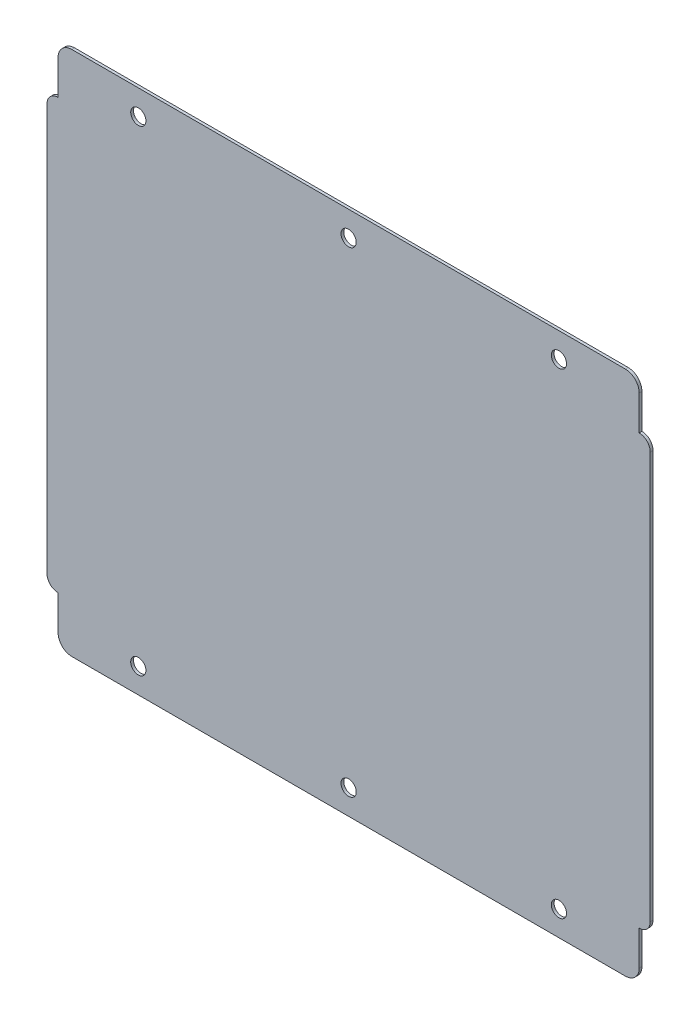
ISO-10303-21;
HEADER;
FILE_DESCRIPTION(('STEP AP214'),'2;1');
FILE_NAME('part.step','',(''),(''),'','','');
FILE_SCHEMA(('AUTOMOTIVE_DESIGN { 1 0 10303 214 1 1 1 1 }'));
ENDSEC;
DATA;
#1=APPLICATION_CONTEXT('core data for automotive mechanical design processes');
#2=APPLICATION_PROTOCOL_DEFINITION('international standard','automotive_design',2000,#1);
#3=PRODUCT_CONTEXT('',#1,'mechanical');
#4=PRODUCT('Part','Part','',(#3));
#5=PRODUCT_RELATED_PRODUCT_CATEGORY('part','',(#4));
#6=PRODUCT_DEFINITION_FORMATION('','',#4);
#7=PRODUCT_DEFINITION_CONTEXT('part definition',#1,'design');
#8=PRODUCT_DEFINITION('design','',#6,#7);
#9=PRODUCT_DEFINITION_SHAPE('','',#8);
#10=(LENGTH_UNIT() NAMED_UNIT(*) SI_UNIT(.MILLI.,.METRE.));
#11=(NAMED_UNIT(*) PLANE_ANGLE_UNIT() SI_UNIT($,.RADIAN.));
#12=(NAMED_UNIT(*) SI_UNIT($,.STERADIAN.) SOLID_ANGLE_UNIT());
#13=UNCERTAINTY_MEASURE_WITH_UNIT(LENGTH_MEASURE(1.E-05),#10,'distance_accuracy_value','');
#14=(GEOMETRIC_REPRESENTATION_CONTEXT(3) GLOBAL_UNCERTAINTY_ASSIGNED_CONTEXT((#13)) GLOBAL_UNIT_ASSIGNED_CONTEXT((#10,
#11,#12)) REPRESENTATION_CONTEXT('',''));
#15=CARTESIAN_POINT('',(0.,0.,0.));
#16=DIRECTION('',(0.,0.,1.));
#17=DIRECTION('',(1.,0.,0.));
#18=AXIS2_PLACEMENT_3D('',#15,#16,#17);
#19=CARTESIAN_POINT('',(210.,155.,1.));
#20=DIRECTION('',(-1.,0.,0.));
#21=DIRECTION('',(0.,0.,1.));
#22=AXIS2_PLACEMENT_3D('',#19,#20,#21);
#23=PLANE('',#22);
#24=DIRECTION('',(0.,1.,0.));
#25=VECTOR('',#24,1.);
#26=CARTESIAN_POINT('',(210.,155.,-1.));
#27=LINE('',#26,#25);
#28=CARTESIAN_POINT('',(210.,155.,-1.));
#29=VERTEX_POINT('',#28);
#30=CARTESIAN_POINT('',(210.,180.,-1.));
#31=VERTEX_POINT('',#30);
#32=EDGE_CURVE('E254',#29,#31,#27,.T.);
#33=ORIENTED_EDGE('',*,*,#32,.T.);
#34=DIRECTION('',(0.,0.,-1.));
#35=VECTOR('',#34,1.);
#36=CARTESIAN_POINT('',(210.,180.,1.));
#37=LINE('',#36,#35);
#38=CARTESIAN_POINT('',(210.,180.,1.));
#39=VERTEX_POINT('',#38);
#40=EDGE_CURVE('E170',#31,#39,#37,.F.);
#41=ORIENTED_EDGE('',*,*,#40,.T.);
#42=DIRECTION('',(0.,1.,0.));
#43=VECTOR('',#42,1.);
#44=CARTESIAN_POINT('',(210.,155.,1.));
#45=LINE('',#44,#43);
#46=CARTESIAN_POINT('',(210.,155.,1.));
#47=VERTEX_POINT('',#46);
#48=EDGE_CURVE('E158',#47,#39,#45,.T.);
#49=ORIENTED_EDGE('',*,*,#48,.F.);
#50=DIRECTION('',(0.,0.,-1.));
#51=VECTOR('',#50,1.);
#52=CARTESIAN_POINT('',(210.,155.,1.));
#53=LINE('',#52,#51);
#54=EDGE_CURVE('E168',#47,#29,#53,.T.);
#55=ORIENTED_EDGE('',*,*,#54,.T.);
#56=EDGE_LOOP('',(#33,#41,#49,#55));
#57=FACE_BOUND('',#56,.T.);
#58=ADVANCED_FACE('F41',(#57),#23,.F.);
#59=CARTESIAN_POINT('',(-210.,190.,1.));
#60=DIRECTION('',(0.,-1.,0.));
#61=DIRECTION('',(0.,0.,-1.));
#62=AXIS2_PLACEMENT_3D('',#59,#60,#61);
#63=PLANE('',#62);
#64=DIRECTION('',(-1.,0.,0.));
#65=VECTOR('',#64,1.);
#66=CARTESIAN_POINT('',(-210.,190.,1.));
#67=LINE('',#66,#65);
#68=CARTESIAN_POINT('',(200.,190.,1.));
#69=VERTEX_POINT('',#68);
#70=CARTESIAN_POINT('',(-200.,190.,1.));
#71=VERTEX_POINT('',#70);
#72=EDGE_CURVE('E171',#69,#71,#67,.T.);
#73=ORIENTED_EDGE('',*,*,#72,.F.);
#74=DIRECTION('',(0.,0.,-1.));
#75=VECTOR('',#74,1.);
#76=CARTESIAN_POINT('',(200.,190.,1.));
#77=LINE('',#76,#75);
#78=CARTESIAN_POINT('',(200.,190.,-1.));
#79=VERTEX_POINT('',#78);
#80=EDGE_CURVE('E180',#69,#79,#77,.T.);
#81=ORIENTED_EDGE('',*,*,#80,.T.);
#82=DIRECTION('',(-1.,0.,0.));
#83=VECTOR('',#82,1.);
#84=CARTESIAN_POINT('',(-210.,190.,-1.));
#85=LINE('',#84,#83);
#86=CARTESIAN_POINT('',(-200.,190.,-1.));
#87=VERTEX_POINT('',#86);
#88=EDGE_CURVE('E257',#79,#87,#85,.T.);
#89=ORIENTED_EDGE('',*,*,#88,.T.);
#90=DIRECTION('',(0.,0.,-1.));
#91=VECTOR('',#90,1.);
#92=CARTESIAN_POINT('',(-200.,190.,1.));
#93=LINE('',#92,#91);
#94=EDGE_CURVE('E177',#87,#71,#93,.F.);
#95=ORIENTED_EDGE('',*,*,#94,.T.);
#96=EDGE_LOOP('',(#73,#81,#89,#95));
#97=FACE_BOUND('',#96,.T.);
#98=ADVANCED_FACE('F363',(#97),#63,.F.);
#99=CARTESIAN_POINT('',(-210.,155.,1.));
#100=DIRECTION('',(1.,0.,0.));
#101=DIRECTION('',(0.,0.,-1.));
#102=AXIS2_PLACEMENT_3D('',#99,#100,#101);
#103=PLANE('',#102);
#104=DIRECTION('',(0.,-1.,0.));
#105=VECTOR('',#104,1.);
#106=CARTESIAN_POINT('',(-210.,155.,1.));
#107=LINE('',#106,#105);
#108=CARTESIAN_POINT('',(-210.,180.,1.));
#109=VERTEX_POINT('',#108);
#110=CARTESIAN_POINT('',(-210.,155.,1.));
#111=VERTEX_POINT('',#110);
#112=EDGE_CURVE('E314',#109,#111,#107,.T.);
#113=ORIENTED_EDGE('',*,*,#112,.F.);
#114=DIRECTION('',(0.,0.,-1.));
#115=VECTOR('',#114,1.);
#116=CARTESIAN_POINT('',(-210.,180.,1.));
#117=LINE('',#116,#115);
#118=CARTESIAN_POINT('',(-210.,180.,-1.));
#119=VERTEX_POINT('',#118);
#120=EDGE_CURVE('E216',#109,#119,#117,.T.);
#121=ORIENTED_EDGE('',*,*,#120,.T.);
#122=DIRECTION('',(0.,-1.,0.));
#123=VECTOR('',#122,1.);
#124=CARTESIAN_POINT('',(-210.,155.,-1.));
#125=LINE('',#124,#123);
#126=CARTESIAN_POINT('',(-210.,155.,-1.));
#127=VERTEX_POINT('',#126);
#128=EDGE_CURVE('E260',#119,#127,#125,.T.);
#129=ORIENTED_EDGE('',*,*,#128,.T.);
#130=DIRECTION('',(0.,0.,-1.));
#131=VECTOR('',#130,1.);
#132=CARTESIAN_POINT('',(-210.,155.,1.));
#133=LINE('',#132,#131);
#134=EDGE_CURVE('E178',#111,#127,#133,.T.);
#135=ORIENTED_EDGE('',*,*,#134,.F.);
#136=EDGE_LOOP('',(#113,#121,#129,#135));
#137=FACE_BOUND('',#136,.T.);
#138=ADVANCED_FACE('F370',(#137),#103,.F.);
#139=CARTESIAN_POINT('',(-218.,-155.,1.));
#140=DIRECTION('',(1.,0.,0.));
#141=DIRECTION('',(0.,0.,-1.));
#142=AXIS2_PLACEMENT_3D('',#139,#140,#141);
#143=PLANE('',#142);
#144=DIRECTION('',(0.,-1.,0.));
#145=VECTOR('',#144,1.);
#146=CARTESIAN_POINT('',(-218.,-155.,-1.));
#147=LINE('',#146,#145);
#148=CARTESIAN_POINT('',(-218.,147.,-1.));
#149=VERTEX_POINT('',#148);
#150=CARTESIAN_POINT('',(-218.,-147.,-1.));
#151=VERTEX_POINT('',#150);
#152=EDGE_CURVE('E267',#149,#151,#147,.T.);
#153=ORIENTED_EDGE('',*,*,#152,.T.);
#154=DIRECTION('',(0.,0.,-1.));
#155=VECTOR('',#154,1.);
#156=CARTESIAN_POINT('',(-218.,-147.,1.));
#157=LINE('',#156,#155);
#158=CARTESIAN_POINT('',(-218.,-147.,1.));
#159=VERTEX_POINT('',#158);
#160=EDGE_CURVE('E229',#151,#159,#157,.F.);
#161=ORIENTED_EDGE('',*,*,#160,.T.);
#162=DIRECTION('',(0.,-1.,0.));
#163=VECTOR('',#162,1.);
#164=CARTESIAN_POINT('',(-218.,-155.,1.));
#165=LINE('',#164,#163);
#166=CARTESIAN_POINT('',(-218.,147.,1.));
#167=VERTEX_POINT('',#166);
#168=EDGE_CURVE('E310',#167,#159,#165,.T.);
#169=ORIENTED_EDGE('',*,*,#168,.F.);
#170=DIRECTION('',(0.,0.,-1.));
#171=VECTOR('',#170,1.);
#172=CARTESIAN_POINT('',(-218.,147.,1.));
#173=LINE('',#172,#171);
#174=EDGE_CURVE('E226',#167,#149,#173,.T.);
#175=ORIENTED_EDGE('',*,*,#174,.T.);
#176=EDGE_LOOP('',(#153,#161,#169,#175));
#177=FACE_BOUND('',#176,.T.);
#178=ADVANCED_FACE('F414',(#177),#143,.F.);
#179=CARTESIAN_POINT('',(-210.,-155.,1.));
#180=DIRECTION('',(1.,0.,0.));
#181=DIRECTION('',(0.,0.,-1.));
#182=AXIS2_PLACEMENT_3D('',#179,#180,#181);
#183=PLANE('',#182);
#184=DIRECTION('',(0.,-1.,0.));
#185=VECTOR('',#184,1.);
#186=CARTESIAN_POINT('',(-210.,-155.,-1.));
#187=LINE('',#186,#185);
#188=CARTESIAN_POINT('',(-210.,-155.,-1.));
#189=VERTEX_POINT('',#188);
#190=CARTESIAN_POINT('',(-210.,-180.,-1.));
#191=VERTEX_POINT('',#190);
#192=EDGE_CURVE('E270',#189,#191,#187,.T.);
#193=ORIENTED_EDGE('',*,*,#192,.T.);
#194=DIRECTION('',(0.,0.,-1.));
#195=VECTOR('',#194,1.);
#196=CARTESIAN_POINT('',(-210.,-180.,1.));
#197=LINE('',#196,#195);
#198=CARTESIAN_POINT('',(-210.,-180.,1.));
#199=VERTEX_POINT('',#198);
#200=EDGE_CURVE('E214',#191,#199,#197,.F.);
#201=ORIENTED_EDGE('',*,*,#200,.T.);
#202=DIRECTION('',(0.,-1.,0.));
#203=VECTOR('',#202,1.);
#204=CARTESIAN_POINT('',(-210.,-155.,1.));
#205=LINE('',#204,#203);
#206=CARTESIAN_POINT('',(-210.,-155.,1.));
#207=VERTEX_POINT('',#206);
#208=EDGE_CURVE('E290',#207,#199,#205,.T.);
#209=ORIENTED_EDGE('',*,*,#208,.F.);
#210=DIRECTION('',(0.,0.,-1.));
#211=VECTOR('',#210,1.);
#212=CARTESIAN_POINT('',(-210.,-155.,1.));
#213=LINE('',#212,#211);
#214=EDGE_CURVE('E183',#207,#189,#213,.T.);
#215=ORIENTED_EDGE('',*,*,#214,.T.);
#216=EDGE_LOOP('',(#193,#201,#209,#215));
#217=FACE_BOUND('',#216,.T.);
#218=ADVANCED_FACE('F287',(#217),#183,.F.);
#219=CARTESIAN_POINT('',(-210.,-190.,1.));
#220=DIRECTION('',(0.,1.,0.));
#221=DIRECTION('',(0.,0.,1.));
#222=AXIS2_PLACEMENT_3D('',#219,#220,#221);
#223=PLANE('',#222);
#224=DIRECTION('',(1.,0.,0.));
#225=VECTOR('',#224,1.);
#226=CARTESIAN_POINT('',(-210.,-190.,-1.));
#227=LINE('',#226,#225);
#228=CARTESIAN_POINT('',(-200.,-190.,-1.));
#229=VERTEX_POINT('',#228);
#230=CARTESIAN_POINT('',(200.,-190.,-1.));
#231=VERTEX_POINT('',#230);
#232=EDGE_CURVE('E273',#229,#231,#227,.T.);
#233=ORIENTED_EDGE('',*,*,#232,.T.);
#234=DIRECTION('',(0.,0.,-1.));
#235=VECTOR('',#234,1.);
#236=CARTESIAN_POINT('',(200.,-190.,1.));
#237=LINE('',#236,#235);
#238=CARTESIAN_POINT('',(200.,-190.,1.));
#239=VERTEX_POINT('',#238);
#240=EDGE_CURVE('E212',#231,#239,#237,.F.);
#241=ORIENTED_EDGE('',*,*,#240,.T.);
#242=DIRECTION('',(1.,0.,0.));
#243=VECTOR('',#242,1.);
#244=CARTESIAN_POINT('',(-210.,-190.,1.));
#245=LINE('',#244,#243);
#246=CARTESIAN_POINT('',(-200.,-190.,1.));
#247=VERTEX_POINT('',#246);
#248=EDGE_CURVE('E306',#247,#239,#245,.T.);
#249=ORIENTED_EDGE('',*,*,#248,.F.);
#250=DIRECTION('',(0.,0.,-1.));
#251=VECTOR('',#250,1.);
#252=CARTESIAN_POINT('',(-200.,-190.,1.));
#253=LINE('',#252,#251);
#254=EDGE_CURVE('E209',#247,#229,#253,.T.);
#255=ORIENTED_EDGE('',*,*,#254,.T.);
#256=EDGE_LOOP('',(#233,#241,#249,#255));
#257=FACE_BOUND('',#256,.T.);
#258=ADVANCED_FACE('F303',(#257),#223,.F.);
#259=CARTESIAN_POINT('',(210.,-155.,1.));
#260=DIRECTION('',(-1.,0.,0.));
#261=DIRECTION('',(0.,0.,1.));
#262=AXIS2_PLACEMENT_3D('',#259,#260,#261);
#263=PLANE('',#262);
#264=DIRECTION('',(0.,1.,0.));
#265=VECTOR('',#264,1.);
#266=CARTESIAN_POINT('',(210.,-155.,1.));
#267=LINE('',#266,#265);
#268=CARTESIAN_POINT('',(210.,-180.,1.));
#269=VERTEX_POINT('',#268);
#270=CARTESIAN_POINT('',(210.,-155.,1.));
#271=VERTEX_POINT('',#270);
#272=EDGE_CURVE('E308',#269,#271,#267,.T.);
#273=ORIENTED_EDGE('',*,*,#272,.F.);
#274=DIRECTION('',(0.,0.,-1.));
#275=VECTOR('',#274,1.);
#276=CARTESIAN_POINT('',(210.,-180.,1.));
#277=LINE('',#276,#275);
#278=CARTESIAN_POINT('',(210.,-180.,-1.));
#279=VERTEX_POINT('',#278);
#280=EDGE_CURVE('E206',#269,#279,#277,.T.);
#281=ORIENTED_EDGE('',*,*,#280,.T.);
#282=DIRECTION('',(0.,1.,0.));
#283=VECTOR('',#282,1.);
#284=CARTESIAN_POINT('',(210.,-155.,-1.));
#285=LINE('',#284,#283);
#286=CARTESIAN_POINT('',(210.,-155.,-1.));
#287=VERTEX_POINT('',#286);
#288=EDGE_CURVE('E276',#279,#287,#285,.T.);
#289=ORIENTED_EDGE('',*,*,#288,.T.);
#290=DIRECTION('',(0.,0.,-1.));
#291=VECTOR('',#290,1.);
#292=CARTESIAN_POINT('',(210.,-155.,1.));
#293=LINE('',#292,#291);
#294=EDGE_CURVE('E280',#271,#287,#293,.T.);
#295=ORIENTED_EDGE('',*,*,#294,.F.);
#296=EDGE_LOOP('',(#273,#281,#289,#295));
#297=FACE_BOUND('',#296,.T.);
#298=ADVANCED_FACE('F425',(#297),#263,.F.);
#299=CARTESIAN_POINT('',(218.,-155.,1.));
#300=DIRECTION('',(-1.,0.,0.));
#301=DIRECTION('',(0.,0.,1.));
#302=AXIS2_PLACEMENT_3D('',#299,#300,#301);
#303=PLANE('',#302);
#304=DIRECTION('',(0.,1.,0.));
#305=VECTOR('',#304,1.);
#306=CARTESIAN_POINT('',(218.,-155.,-1.));
#307=LINE('',#306,#305);
#308=CARTESIAN_POINT('',(218.,-147.,-1.));
#309=VERTEX_POINT('',#308);
#310=CARTESIAN_POINT('',(218.,147.,-1.));
#311=VERTEX_POINT('',#310);
#312=EDGE_CURVE('E172',#309,#311,#307,.T.);
#313=ORIENTED_EDGE('',*,*,#312,.T.);
#314=DIRECTION('',(0.,0.,-1.));
#315=VECTOR('',#314,1.);
#316=CARTESIAN_POINT('',(218.,147.,1.));
#317=LINE('',#316,#315);
#318=CARTESIAN_POINT('',(218.,147.,1.));
#319=VERTEX_POINT('',#318);
#320=EDGE_CURVE('E11',#311,#319,#317,.F.);
#321=ORIENTED_EDGE('',*,*,#320,.T.);
#322=DIRECTION('',(0.,1.,0.));
#323=VECTOR('',#322,1.);
#324=CARTESIAN_POINT('',(218.,-155.,1.));
#325=LINE('',#324,#323);
#326=CARTESIAN_POINT('',(218.,-147.,1.));
#327=VERTEX_POINT('',#326);
#328=EDGE_CURVE('E160',#327,#319,#325,.T.);
#329=ORIENTED_EDGE('',*,*,#328,.F.);
#330=DIRECTION('',(0.,0.,-1.));
#331=VECTOR('',#330,1.);
#332=CARTESIAN_POINT('',(218.,-147.,1.));
#333=LINE('',#332,#331);
#334=EDGE_CURVE('E50',#327,#309,#333,.T.);
#335=ORIENTED_EDGE('',*,*,#334,.T.);
#336=EDGE_LOOP('',(#313,#321,#329,#335));
#337=FACE_BOUND('',#336,.T.);
#338=ADVANCED_FACE('F341',(#337),#303,.F.);
#339=CARTESIAN_POINT('',(0.,0.,1.));
#340=DIRECTION('',(0.,0.,1.));
#341=DIRECTION('',(1.,0.,0.));
#342=AXIS2_PLACEMENT_3D('',#339,#340,#341);
#343=PLANE('',#342);
#344=CARTESIAN_POINT('',(152.,-172.,1.));
#345=DIRECTION('',(0.,0.,1.));
#346=DIRECTION('',(1.,0.,0.));
#347=AXIS2_PLACEMENT_3D('',#344,#345,#346);
#348=CIRCLE('',#347,5.50000000000004);
#349=CARTESIAN_POINT('',(157.5,-172.,1.));
#350=VERTEX_POINT('',#349);
#351=EDGE_CURVE('E320',#350,#350,#348,.T.);
#352=ORIENTED_EDGE('',*,*,#351,.F.);
#353=EDGE_LOOP('',(#352));
#354=FACE_BOUND('',#353,.T.);
#355=CARTESIAN_POINT('',(-152.,-172.,1.));
#356=DIRECTION('',(0.,0.,1.));
#357=DIRECTION('',(-1.,0.,0.));
#358=AXIS2_PLACEMENT_3D('',#355,#356,#357);
#359=CIRCLE('',#358,5.50000000000002);
#360=CARTESIAN_POINT('',(-157.5,-172.,1.));
#361=VERTEX_POINT('',#360);
#362=EDGE_CURVE('E328',#361,#361,#359,.T.);
#363=ORIENTED_EDGE('',*,*,#362,.F.);
#364=EDGE_LOOP('',(#363));
#365=FACE_BOUND('',#364,.T.);
#366=CARTESIAN_POINT('',(-152.,172.,1.));
#367=DIRECTION('',(0.,0.,1.));
#368=DIRECTION('',(1.,0.,0.));
#369=AXIS2_PLACEMENT_3D('',#366,#367,#368);
#370=CIRCLE('',#369,5.50000000000002);
#371=CARTESIAN_POINT('',(-146.5,172.,1.));
#372=VERTEX_POINT('',#371);
#373=EDGE_CURVE('E324',#372,#372,#370,.T.);
#374=ORIENTED_EDGE('',*,*,#373,.F.);
#375=EDGE_LOOP('',(#374));
#376=FACE_BOUND('',#375,.T.);
#377=CARTESIAN_POINT('',(152.,172.,1.));
#378=DIRECTION('',(0.,0.,1.));
#379=DIRECTION('',(-1.,0.,0.));
#380=AXIS2_PLACEMENT_3D('',#377,#378,#379);
#381=CIRCLE('',#380,5.50000000000004);
#382=CARTESIAN_POINT('',(146.5,172.,1.));
#383=VERTEX_POINT('',#382);
#384=EDGE_CURVE('E321',#383,#383,#381,.T.);
#385=ORIENTED_EDGE('',*,*,#384,.F.);
#386=EDGE_LOOP('',(#385));
#387=FACE_BOUND('',#386,.T.);
#388=CARTESIAN_POINT('',(0.,172.,1.));
#389=DIRECTION('',(0.,0.,1.));
#390=DIRECTION('',(-1.,0.,0.));
#391=AXIS2_PLACEMENT_3D('',#388,#389,#390);
#392=CIRCLE('',#391,5.5);
#393=CARTESIAN_POINT('',(-5.50000000000006,172.,1.));
#394=VERTEX_POINT('',#393);
#395=EDGE_CURVE('E325',#394,#394,#392,.T.);
#396=ORIENTED_EDGE('',*,*,#395,.F.);
#397=EDGE_LOOP('',(#396));
#398=FACE_BOUND('',#397,.T.);
#399=CARTESIAN_POINT('',(0.,-172.,1.));
#400=DIRECTION('',(0.,0.,1.));
#401=DIRECTION('',(1.,0.,0.));
#402=AXIS2_PLACEMENT_3D('',#399,#400,#401);
#403=CIRCLE('',#402,5.5);
#404=CARTESIAN_POINT('',(5.49999999999997,-172.,1.));
#405=VERTEX_POINT('',#404);
#406=EDGE_CURVE('E241',#405,#405,#403,.T.);
#407=ORIENTED_EDGE('',*,*,#406,.F.);
#408=EDGE_LOOP('',(#407));
#409=FACE_BOUND('',#408,.T.);
#410=ORIENTED_EDGE('',*,*,#168,.T.);
#411=CARTESIAN_POINT('',(-210.,-147.,1.));
#412=DIRECTION('',(0.,0.,1.));
#413=DIRECTION('',(1.,0.,0.));
#414=AXIS2_PLACEMENT_3D('',#411,#412,#413);
#415=CIRCLE('',#414,8.);
#416=EDGE_CURVE('E233',#159,#207,#415,.T.);
#417=ORIENTED_EDGE('',*,*,#416,.T.);
#418=ORIENTED_EDGE('',*,*,#208,.T.);
#419=CARTESIAN_POINT('',(-200.,-180.,1.));
#420=DIRECTION('',(0.,0.,1.));
#421=DIRECTION('',(1.,0.,0.));
#422=AXIS2_PLACEMENT_3D('',#419,#420,#421);
#423=CIRCLE('',#422,10.);
#424=EDGE_CURVE('E200',#199,#247,#423,.T.);
#425=ORIENTED_EDGE('',*,*,#424,.T.);
#426=ORIENTED_EDGE('',*,*,#248,.T.);
#427=CARTESIAN_POINT('',(200.,-180.,1.));
#428=DIRECTION('',(0.,0.,1.));
#429=DIRECTION('',(1.,0.,0.));
#430=AXIS2_PLACEMENT_3D('',#427,#428,#429);
#431=CIRCLE('',#430,10.);
#432=EDGE_CURVE('E202',#239,#269,#431,.T.);
#433=ORIENTED_EDGE('',*,*,#432,.T.);
#434=ORIENTED_EDGE('',*,*,#272,.T.);
#435=CARTESIAN_POINT('',(210.,-147.,1.));
#436=DIRECTION('',(0.,0.,1.));
#437=DIRECTION('',(1.,0.,0.));
#438=AXIS2_PLACEMENT_3D('',#435,#436,#437);
#439=CIRCLE('',#438,8.);
#440=EDGE_CURVE('E63',#271,#327,#439,.T.);
#441=ORIENTED_EDGE('',*,*,#440,.T.);
#442=ORIENTED_EDGE('',*,*,#328,.T.);
#443=CARTESIAN_POINT('',(210.,147.,1.));
#444=DIRECTION('',(0.,0.,1.));
#445=DIRECTION('',(1.,0.,0.));
#446=AXIS2_PLACEMENT_3D('',#443,#444,#445);
#447=CIRCLE('',#446,8.);
#448=EDGE_CURVE('E154',#319,#47,#447,.T.);
#449=ORIENTED_EDGE('',*,*,#448,.T.);
#450=ORIENTED_EDGE('',*,*,#48,.T.);
#451=CARTESIAN_POINT('',(200.,180.,1.));
#452=DIRECTION('',(0.,0.,1.));
#453=DIRECTION('',(1.,0.,0.));
#454=AXIS2_PLACEMENT_3D('',#451,#452,#453);
#455=CIRCLE('',#454,10.);
#456=EDGE_CURVE('E204',#39,#69,#455,.T.);
#457=ORIENTED_EDGE('',*,*,#456,.T.);
#458=ORIENTED_EDGE('',*,*,#72,.T.);
#459=CARTESIAN_POINT('',(-200.,180.,1.));
#460=DIRECTION('',(0.,0.,1.));
#461=DIRECTION('',(1.,0.,0.));
#462=AXIS2_PLACEMENT_3D('',#459,#460,#461);
#463=CIRCLE('',#462,10.);
#464=EDGE_CURVE('E198',#71,#109,#463,.T.);
#465=ORIENTED_EDGE('',*,*,#464,.T.);
#466=ORIENTED_EDGE('',*,*,#112,.T.);
#467=CARTESIAN_POINT('',(-210.,147.,1.));
#468=DIRECTION('',(0.,0.,1.));
#469=DIRECTION('',(1.,0.,0.));
#470=AXIS2_PLACEMENT_3D('',#467,#468,#469);
#471=CIRCLE('',#470,8.);
#472=EDGE_CURVE('E163',#111,#167,#471,.T.);
#473=ORIENTED_EDGE('',*,*,#472,.T.);
#474=EDGE_LOOP('',(#410,#417,#418,#425,#426,#433,#434,#441,#442,#449,#450,#457,#458,#465,#466,#473));
#475=FACE_BOUND('',#474,.T.);
#476=ADVANCED_FACE('F157',(#354,#365,#376,#387,#398,#409,#475),#343,.T.);
#477=CARTESIAN_POINT('',(0.,0.,-1.));
#478=DIRECTION('',(0.,0.,1.));
#479=DIRECTION('',(1.,0.,0.));
#480=AXIS2_PLACEMENT_3D('',#477,#478,#479);
#481=PLANE('',#480);
#482=CARTESIAN_POINT('',(152.,-172.,-1.));
#483=DIRECTION('',(0.,0.,1.));
#484=DIRECTION('',(1.,0.,0.));
#485=AXIS2_PLACEMENT_3D('',#482,#483,#484);
#486=CIRCLE('',#485,5.50000000000004);
#487=CARTESIAN_POINT('',(157.5,-172.,-1.));
#488=VERTEX_POINT('',#487);
#489=EDGE_CURVE('E45',#488,#488,#486,.T.);
#490=ORIENTED_EDGE('',*,*,#489,.T.);
#491=EDGE_LOOP('',(#490));
#492=FACE_BOUND('',#491,.T.);
#493=CARTESIAN_POINT('',(-152.,-172.,-1.));
#494=DIRECTION('',(0.,0.,1.));
#495=DIRECTION('',(1.,0.,0.));
#496=AXIS2_PLACEMENT_3D('',#493,#494,#495);
#497=CIRCLE('',#496,5.50000000000002);
#498=CARTESIAN_POINT('',(-146.5,-172.,-1.));
#499=VERTEX_POINT('',#498);
#500=EDGE_CURVE('E249',#499,#499,#497,.T.);
#501=ORIENTED_EDGE('',*,*,#500,.T.);
#502=EDGE_LOOP('',(#501));
#503=FACE_BOUND('',#502,.T.);
#504=CARTESIAN_POINT('',(-152.,172.,-1.));
#505=DIRECTION('',(0.,0.,1.));
#506=DIRECTION('',(1.,0.,0.));
#507=AXIS2_PLACEMENT_3D('',#504,#505,#506);
#508=CIRCLE('',#507,5.50000000000002);
#509=CARTESIAN_POINT('',(-146.5,172.,-1.));
#510=VERTEX_POINT('',#509);
#511=EDGE_CURVE('E247',#510,#510,#508,.T.);
#512=ORIENTED_EDGE('',*,*,#511,.T.);
#513=EDGE_LOOP('',(#512));
#514=FACE_BOUND('',#513,.T.);
#515=CARTESIAN_POINT('',(152.,172.,-1.));
#516=DIRECTION('',(0.,0.,1.));
#517=DIRECTION('',(1.,0.,0.));
#518=AXIS2_PLACEMENT_3D('',#515,#516,#517);
#519=CIRCLE('',#518,5.50000000000004);
#520=CARTESIAN_POINT('',(157.5,172.,-1.));
#521=VERTEX_POINT('',#520);
#522=EDGE_CURVE('E244',#521,#521,#519,.T.);
#523=ORIENTED_EDGE('',*,*,#522,.T.);
#524=EDGE_LOOP('',(#523));
#525=FACE_BOUND('',#524,.T.);
#526=CARTESIAN_POINT('',(0.,172.,-1.));
#527=DIRECTION('',(0.,0.,1.));
#528=DIRECTION('',(1.,0.,0.));
#529=AXIS2_PLACEMENT_3D('',#526,#527,#528);
#530=CIRCLE('',#529,5.5);
#531=CARTESIAN_POINT('',(5.49999999999994,172.,-1.));
#532=VERTEX_POINT('',#531);
#533=EDGE_CURVE('E240',#532,#532,#530,.T.);
#534=ORIENTED_EDGE('',*,*,#533,.T.);
#535=EDGE_LOOP('',(#534));
#536=FACE_BOUND('',#535,.T.);
#537=CARTESIAN_POINT('',(0.,-172.,-1.));
#538=DIRECTION('',(0.,0.,1.));
#539=DIRECTION('',(1.,0.,0.));
#540=AXIS2_PLACEMENT_3D('',#537,#538,#539);
#541=CIRCLE('',#540,5.5);
#542=CARTESIAN_POINT('',(5.49999999999997,-172.,-1.));
#543=VERTEX_POINT('',#542);
#544=EDGE_CURVE('E237',#543,#543,#541,.T.);
#545=ORIENTED_EDGE('',*,*,#544,.T.);
#546=EDGE_LOOP('',(#545));
#547=FACE_BOUND('',#546,.T.);
#548=ORIENTED_EDGE('',*,*,#192,.F.);
#549=CARTESIAN_POINT('',(-210.,-147.,-1.));
#550=DIRECTION('',(0.,0.,1.));
#551=DIRECTION('',(1.,0.,0.));
#552=AXIS2_PLACEMENT_3D('',#549,#550,#551);
#553=CIRCLE('',#552,8.);
#554=EDGE_CURVE('E224',#189,#151,#553,.F.);
#555=ORIENTED_EDGE('',*,*,#554,.T.);
#556=ORIENTED_EDGE('',*,*,#152,.F.);
#557=CARTESIAN_POINT('',(-210.,147.,-1.));
#558=DIRECTION('',(0.,0.,1.));
#559=DIRECTION('',(1.,0.,0.));
#560=AXIS2_PLACEMENT_3D('',#557,#558,#559);
#561=CIRCLE('',#560,8.);
#562=EDGE_CURVE('E222',#149,#127,#561,.F.);
#563=ORIENTED_EDGE('',*,*,#562,.T.);
#564=ORIENTED_EDGE('',*,*,#128,.F.);
#565=CARTESIAN_POINT('',(-200.,180.,-1.));
#566=DIRECTION('',(0.,0.,1.));
#567=DIRECTION('',(1.,0.,0.));
#568=AXIS2_PLACEMENT_3D('',#565,#566,#567);
#569=CIRCLE('',#568,10.);
#570=EDGE_CURVE('E189',#119,#87,#569,.F.);
#571=ORIENTED_EDGE('',*,*,#570,.T.);
#572=ORIENTED_EDGE('',*,*,#88,.F.);
#573=CARTESIAN_POINT('',(200.,180.,-1.));
#574=DIRECTION('',(0.,0.,1.));
#575=DIRECTION('',(1.,0.,0.));
#576=AXIS2_PLACEMENT_3D('',#573,#574,#575);
#577=CIRCLE('',#576,10.);
#578=EDGE_CURVE('E195',#79,#31,#577,.F.);
#579=ORIENTED_EDGE('',*,*,#578,.T.);
#580=ORIENTED_EDGE('',*,*,#32,.F.);
#581=CARTESIAN_POINT('',(210.,147.,-1.));
#582=DIRECTION('',(0.,0.,1.));
#583=DIRECTION('',(1.,0.,0.));
#584=AXIS2_PLACEMENT_3D('',#581,#582,#583);
#585=CIRCLE('',#584,8.);
#586=EDGE_CURVE('E175',#29,#311,#585,.F.);
#587=ORIENTED_EDGE('',*,*,#586,.T.);
#588=ORIENTED_EDGE('',*,*,#312,.F.);
#589=CARTESIAN_POINT('',(210.,-147.,-1.));
#590=DIRECTION('',(0.,0.,1.));
#591=DIRECTION('',(1.,0.,0.));
#592=AXIS2_PLACEMENT_3D('',#589,#590,#591);
#593=CIRCLE('',#592,8.);
#594=EDGE_CURVE('E219',#309,#287,#593,.F.);
#595=ORIENTED_EDGE('',*,*,#594,.T.);
#596=ORIENTED_EDGE('',*,*,#288,.F.);
#597=CARTESIAN_POINT('',(200.,-180.,-1.));
#598=DIRECTION('',(0.,0.,1.));
#599=DIRECTION('',(1.,0.,0.));
#600=AXIS2_PLACEMENT_3D('',#597,#598,#599);
#601=CIRCLE('',#600,10.);
#602=EDGE_CURVE('E193',#279,#231,#601,.F.);
#603=ORIENTED_EDGE('',*,*,#602,.T.);
#604=ORIENTED_EDGE('',*,*,#232,.F.);
#605=CARTESIAN_POINT('',(-200.,-180.,-1.));
#606=DIRECTION('',(0.,0.,1.));
#607=DIRECTION('',(1.,0.,0.));
#608=AXIS2_PLACEMENT_3D('',#605,#606,#607);
#609=CIRCLE('',#608,10.);
#610=EDGE_CURVE('E191',#229,#191,#609,.F.);
#611=ORIENTED_EDGE('',*,*,#610,.T.);
#612=EDGE_LOOP('',(#548,#555,#556,#563,#564,#571,#572,#579,#580,#587,#588,#595,#596,#603,#604,#611));
#613=FACE_BOUND('',#612,.T.);
#614=ADVANCED_FACE('F294',(#492,#503,#514,#525,#536,#547,#613),#481,.F.);
#615=CARTESIAN_POINT('',(200.,180.,1.));
#616=DIRECTION('',(0.,0.,-1.));
#617=DIRECTION('',(-1.,0.,0.));
#618=AXIS2_PLACEMENT_3D('',#615,#616,#617);
#619=CYLINDRICAL_SURFACE('',#618,10.);
#620=ORIENTED_EDGE('',*,*,#456,.F.);
#621=ORIENTED_EDGE('',*,*,#40,.F.);
#622=ORIENTED_EDGE('',*,*,#578,.F.);
#623=ORIENTED_EDGE('',*,*,#80,.F.);
#624=EDGE_LOOP('',(#620,#621,#622,#623));
#625=FACE_BOUND('',#624,.T.);
#626=ADVANCED_FACE('F353',(#625),#619,.T.);
#627=CARTESIAN_POINT('',(200.,-180.,1.));
#628=DIRECTION('',(0.,0.,-1.));
#629=DIRECTION('',(-1.,0.,0.));
#630=AXIS2_PLACEMENT_3D('',#627,#628,#629);
#631=CYLINDRICAL_SURFACE('',#630,10.);
#632=ORIENTED_EDGE('',*,*,#432,.F.);
#633=ORIENTED_EDGE('',*,*,#240,.F.);
#634=ORIENTED_EDGE('',*,*,#602,.F.);
#635=ORIENTED_EDGE('',*,*,#280,.F.);
#636=EDGE_LOOP('',(#632,#633,#634,#635));
#637=FACE_BOUND('',#636,.T.);
#638=ADVANCED_FACE('F358',(#637),#631,.T.);
#639=CARTESIAN_POINT('',(-200.,-180.,1.));
#640=DIRECTION('',(0.,0.,-1.));
#641=DIRECTION('',(-1.,0.,0.));
#642=AXIS2_PLACEMENT_3D('',#639,#640,#641);
#643=CYLINDRICAL_SURFACE('',#642,10.);
#644=ORIENTED_EDGE('',*,*,#424,.F.);
#645=ORIENTED_EDGE('',*,*,#200,.F.);
#646=ORIENTED_EDGE('',*,*,#610,.F.);
#647=ORIENTED_EDGE('',*,*,#254,.F.);
#648=EDGE_LOOP('',(#644,#645,#646,#647));
#649=FACE_BOUND('',#648,.T.);
#650=ADVANCED_FACE('F300',(#649),#643,.T.);
#651=CARTESIAN_POINT('',(-200.,180.,1.));
#652=DIRECTION('',(0.,0.,-1.));
#653=DIRECTION('',(-1.,0.,0.));
#654=AXIS2_PLACEMENT_3D('',#651,#652,#653);
#655=CYLINDRICAL_SURFACE('',#654,10.);
#656=ORIENTED_EDGE('',*,*,#464,.F.);
#657=ORIENTED_EDGE('',*,*,#94,.F.);
#658=ORIENTED_EDGE('',*,*,#570,.F.);
#659=ORIENTED_EDGE('',*,*,#120,.F.);
#660=EDGE_LOOP('',(#656,#657,#658,#659));
#661=FACE_BOUND('',#660,.T.);
#662=ADVANCED_FACE('F380',(#661),#655,.T.);
#663=CARTESIAN_POINT('',(-210.,-147.,1.));
#664=DIRECTION('',(0.,0.,-1.));
#665=DIRECTION('',(-1.,0.,0.));
#666=AXIS2_PLACEMENT_3D('',#663,#664,#665);
#667=CYLINDRICAL_SURFACE('',#666,8.);
#668=ORIENTED_EDGE('',*,*,#416,.F.);
#669=ORIENTED_EDGE('',*,*,#160,.F.);
#670=ORIENTED_EDGE('',*,*,#554,.F.);
#671=ORIENTED_EDGE('',*,*,#214,.F.);
#672=EDGE_LOOP('',(#668,#669,#670,#671));
#673=FACE_BOUND('',#672,.T.);
#674=ADVANCED_FACE('F382',(#673),#667,.T.);
#675=CARTESIAN_POINT('',(-210.,147.,1.));
#676=DIRECTION('',(0.,0.,-1.));
#677=DIRECTION('',(-1.,0.,0.));
#678=AXIS2_PLACEMENT_3D('',#675,#676,#677);
#679=CYLINDRICAL_SURFACE('',#678,8.);
#680=ORIENTED_EDGE('',*,*,#472,.F.);
#681=ORIENTED_EDGE('',*,*,#134,.T.);
#682=ORIENTED_EDGE('',*,*,#562,.F.);
#683=ORIENTED_EDGE('',*,*,#174,.F.);
#684=EDGE_LOOP('',(#680,#681,#682,#683));
#685=FACE_BOUND('',#684,.T.);
#686=ADVANCED_FACE('F386',(#685),#679,.T.);
#687=CARTESIAN_POINT('',(210.,147.,1.));
#688=DIRECTION('',(0.,0.,-1.));
#689=DIRECTION('',(-1.,0.,0.));
#690=AXIS2_PLACEMENT_3D('',#687,#688,#689);
#691=CYLINDRICAL_SURFACE('',#690,8.);
#692=ORIENTED_EDGE('',*,*,#448,.F.);
#693=ORIENTED_EDGE('',*,*,#320,.F.);
#694=ORIENTED_EDGE('',*,*,#586,.F.);
#695=ORIENTED_EDGE('',*,*,#54,.F.);
#696=EDGE_LOOP('',(#692,#693,#694,#695));
#697=FACE_BOUND('',#696,.T.);
#698=ADVANCED_FACE('F174',(#697),#691,.T.);
#699=CARTESIAN_POINT('',(210.,-147.,1.));
#700=DIRECTION('',(0.,0.,-1.));
#701=DIRECTION('',(-1.,0.,0.));
#702=AXIS2_PLACEMENT_3D('',#699,#700,#701);
#703=CYLINDRICAL_SURFACE('',#702,8.);
#704=ORIENTED_EDGE('',*,*,#440,.F.);
#705=ORIENTED_EDGE('',*,*,#294,.T.);
#706=ORIENTED_EDGE('',*,*,#594,.F.);
#707=ORIENTED_EDGE('',*,*,#334,.F.);
#708=EDGE_LOOP('',(#704,#705,#706,#707));
#709=FACE_BOUND('',#708,.T.);
#710=ADVANCED_FACE('F43',(#709),#703,.T.);
#711=CARTESIAN_POINT('',(0.,-172.,-9.));
#712=DIRECTION('',(0.,0.,1.));
#713=DIRECTION('',(1.,0.,0.));
#714=AXIS2_PLACEMENT_3D('',#711,#712,#713);
#715=CYLINDRICAL_SURFACE('',#714,5.5);
#716=ORIENTED_EDGE('',*,*,#406,.T.);
#717=EDGE_LOOP('',(#716));
#718=FACE_BOUND('',#717,.T.);
#719=ORIENTED_EDGE('',*,*,#544,.F.);
#720=EDGE_LOOP('',(#719));
#721=FACE_BOUND('',#720,.T.);
#722=ADVANCED_FACE('F346',(#718,#721),#715,.F.);
#723=CARTESIAN_POINT('',(0.,172.,-9.));
#724=DIRECTION('',(0.,0.,1.));
#725=DIRECTION('',(1.,0.,0.));
#726=AXIS2_PLACEMENT_3D('',#723,#724,#725);
#727=CYLINDRICAL_SURFACE('',#726,5.5);
#728=ORIENTED_EDGE('',*,*,#395,.T.);
#729=EDGE_LOOP('',(#728));
#730=FACE_BOUND('',#729,.T.);
#731=ORIENTED_EDGE('',*,*,#533,.F.);
#732=EDGE_LOOP('',(#731));
#733=FACE_BOUND('',#732,.T.);
#734=ADVANCED_FACE('F336',(#730,#733),#727,.F.);
#735=CARTESIAN_POINT('',(152.,172.,-9.));
#736=DIRECTION('',(0.,0.,1.));
#737=DIRECTION('',(1.,0.,0.));
#738=AXIS2_PLACEMENT_3D('',#735,#736,#737);
#739=CYLINDRICAL_SURFACE('',#738,5.50000000000004);
#740=ORIENTED_EDGE('',*,*,#384,.T.);
#741=EDGE_LOOP('',(#740));
#742=FACE_BOUND('',#741,.T.);
#743=ORIENTED_EDGE('',*,*,#522,.F.);
#744=EDGE_LOOP('',(#743));
#745=FACE_BOUND('',#744,.T.);
#746=ADVANCED_FACE('F469',(#742,#745),#739,.F.);
#747=CARTESIAN_POINT('',(-152.,172.,-9.));
#748=DIRECTION('',(0.,0.,1.));
#749=DIRECTION('',(1.,0.,0.));
#750=AXIS2_PLACEMENT_3D('',#747,#748,#749);
#751=CYLINDRICAL_SURFACE('',#750,5.50000000000002);
#752=ORIENTED_EDGE('',*,*,#373,.T.);
#753=EDGE_LOOP('',(#752));
#754=FACE_BOUND('',#753,.T.);
#755=ORIENTED_EDGE('',*,*,#511,.F.);
#756=EDGE_LOOP('',(#755));
#757=FACE_BOUND('',#756,.T.);
#758=ADVANCED_FACE('F478',(#754,#757),#751,.F.);
#759=CARTESIAN_POINT('',(-152.,-172.,-9.));
#760=DIRECTION('',(0.,0.,1.));
#761=DIRECTION('',(1.,0.,0.));
#762=AXIS2_PLACEMENT_3D('',#759,#760,#761);
#763=CYLINDRICAL_SURFACE('',#762,5.50000000000002);
#764=ORIENTED_EDGE('',*,*,#362,.T.);
#765=EDGE_LOOP('',(#764));
#766=FACE_BOUND('',#765,.T.);
#767=ORIENTED_EDGE('',*,*,#500,.F.);
#768=EDGE_LOOP('',(#767));
#769=FACE_BOUND('',#768,.T.);
#770=ADVANCED_FACE('F488',(#766,#769),#763,.F.);
#771=CARTESIAN_POINT('',(152.,-172.,-9.));
#772=DIRECTION('',(0.,0.,1.));
#773=DIRECTION('',(1.,0.,0.));
#774=AXIS2_PLACEMENT_3D('',#771,#772,#773);
#775=CYLINDRICAL_SURFACE('',#774,5.50000000000004);
#776=ORIENTED_EDGE('',*,*,#351,.T.);
#777=EDGE_LOOP('',(#776));
#778=FACE_BOUND('',#777,.T.);
#779=ORIENTED_EDGE('',*,*,#489,.F.);
#780=EDGE_LOOP('',(#779));
#781=FACE_BOUND('',#780,.T.);
#782=ADVANCED_FACE('F498',(#778,#781),#775,.F.);
#783=CLOSED_SHELL('',(#58,#98,#138,#178,#218,#258,#298,#338,#476,#614,#626,#638,#650,#662,#674,
#686,#698,#710,#722,#734,#746,#758,#770,#782));
#784=MANIFOLD_SOLID_BREP('B2',#783);
#785=ADVANCED_BREP_SHAPE_REPRESENTATION('',(#18,#784),#14);
#786=SHAPE_DEFINITION_REPRESENTATION(#9,#785);
ENDSEC;
END-ISO-10303-21;
